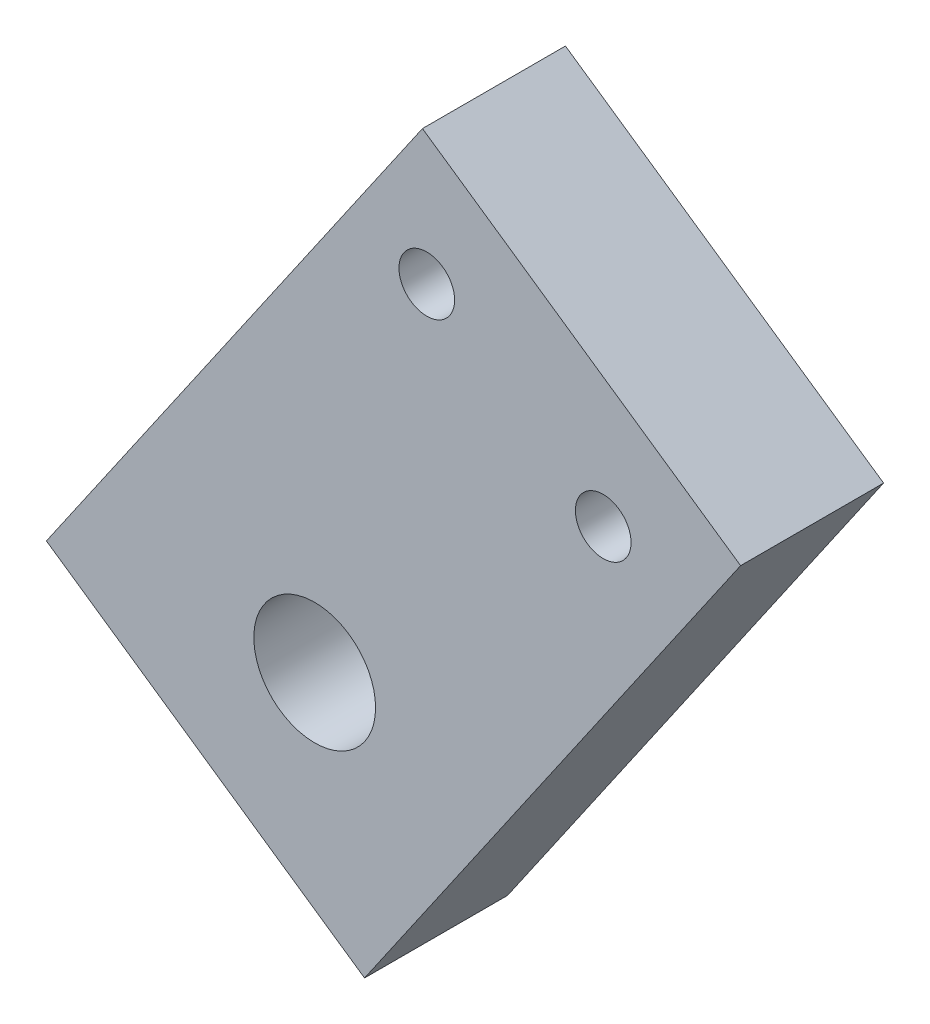
ISO-10303-21;
HEADER;
FILE_DESCRIPTION(('STEP AP214'),'2;1');
FILE_NAME('part.step','',(''),(''),'','','');
FILE_SCHEMA(('AUTOMOTIVE_DESIGN { 1 0 10303 214 1 1 1 1 }'));
ENDSEC;
DATA;
#1=APPLICATION_CONTEXT('core data for automotive mechanical design processes');
#2=APPLICATION_PROTOCOL_DEFINITION('international standard','automotive_design',2000,#1);
#3=PRODUCT_CONTEXT('',#1,'mechanical');
#4=PRODUCT('Part','Part','',(#3));
#5=PRODUCT_RELATED_PRODUCT_CATEGORY('part','',(#4));
#6=PRODUCT_DEFINITION_FORMATION('','',#4);
#7=PRODUCT_DEFINITION_CONTEXT('part definition',#1,'design');
#8=PRODUCT_DEFINITION('design','',#6,#7);
#9=PRODUCT_DEFINITION_SHAPE('','',#8);
#10=(LENGTH_UNIT() NAMED_UNIT(*) SI_UNIT(.MILLI.,.METRE.));
#11=(NAMED_UNIT(*) PLANE_ANGLE_UNIT() SI_UNIT($,.RADIAN.));
#12=(NAMED_UNIT(*) SI_UNIT($,.STERADIAN.) SOLID_ANGLE_UNIT());
#13=UNCERTAINTY_MEASURE_WITH_UNIT(LENGTH_MEASURE(1.E-05),#10,'distance_accuracy_value','');
#14=(GEOMETRIC_REPRESENTATION_CONTEXT(3) GLOBAL_UNCERTAINTY_ASSIGNED_CONTEXT((#13)) GLOBAL_UNIT_ASSIGNED_CONTEXT((#10,
#11,#12)) REPRESENTATION_CONTEXT('',''));
#15=CARTESIAN_POINT('',(0.,0.,0.));
#16=DIRECTION('',(0.,0.,1.));
#17=DIRECTION('',(1.,0.,0.));
#18=AXIS2_PLACEMENT_3D('',#15,#16,#17);
#19=CARTESIAN_POINT('',(-78.6688302859633,-120.640865940608,9.398));
#20=DIRECTION('',(0.,0.,1.));
#21=DIRECTION('',(1.,0.,0.));
#22=AXIS2_PLACEMENT_3D('',#19,#20,#21);
#23=PLANE('',#22);
#24=CARTESIAN_POINT('',(-74.5781091864287,-79.1004132197678,9.398));
#25=DIRECTION('',(0.,0.,1.));
#26=DIRECTION('',(1.,0.,0.));
#27=AXIS2_PLACEMENT_3D('',#24,#25,#26);
#28=CIRCLE('',#27,1.8288);
#29=CARTESIAN_POINT('',(-72.7493091864287,-79.1004132197678,9.398));
#30=VERTEX_POINT('',#29);
#31=EDGE_CURVE('E112',#30,#30,#28,.T.);
#32=ORIENTED_EDGE('',*,*,#31,.F.);
#33=EDGE_LOOP('',(#32));
#34=FACE_BOUND('',#33,.T.);
#35=DIRECTION('',(0.823144688267468,-0.56783168472449,0.));
#36=VECTOR('',#35,1.);
#37=CARTESIAN_POINT('',(-99.576705367957,-106.217941148606,9.398));
#38=LINE('',#37,#36);
#39=CARTESIAN_POINT('',(-99.576705367957,-106.217941148606,9.398));
#40=VERTEX_POINT('',#39);
#41=CARTESIAN_POINT('',(-78.6688302859633,-120.640865940608,9.398));
#42=VERTEX_POINT('',#41);
#43=EDGE_CURVE('E82',#40,#42,#38,.T.);
#44=ORIENTED_EDGE('',*,*,#43,.T.);
#45=DIRECTION('',(0.56783168472449,0.823144688267468,0.));
#46=VECTOR('',#45,1.);
#47=CARTESIAN_POINT('',(-78.6688302859633,-120.640865940608,9.398));
#48=LINE('',#47,#46);
#49=CARTESIAN_POINT('',(-53.954357906258,-84.8140756963151,9.398));
#50=VERTEX_POINT('',#49);
#51=EDGE_CURVE('E77',#42,#50,#48,.T.);
#52=ORIENTED_EDGE('',*,*,#51,.T.);
#53=DIRECTION('',(-0.823144688267468,0.56783168472449,0.));
#54=VECTOR('',#53,1.);
#55=CARTESIAN_POINT('',(-74.8622329882517,-70.3911509043131,9.398));
#56=LINE('',#55,#54);
#57=CARTESIAN_POINT('',(-74.8622329882517,-70.3911509043131,9.398));
#58=VERTEX_POINT('',#57);
#59=EDGE_CURVE('E80',#50,#58,#56,.T.);
#60=ORIENTED_EDGE('',*,*,#59,.T.);
#61=DIRECTION('',(-0.56783168472449,-0.823144688267468,0.));
#62=VECTOR('',#61,1.);
#63=CARTESIAN_POINT('',(-99.576705367957,-106.217941148606,9.398));
#64=LINE('',#63,#62);
#65=EDGE_CURVE('E47',#58,#40,#64,.T.);
#66=ORIENTED_EDGE('',*,*,#65,.T.);
#67=EDGE_LOOP('',(#44,#52,#60,#66));
#68=FACE_BOUND('',#67,.T.);
#69=CARTESIAN_POINT('',(-81.9449970294961,-104.896422338878,9.398));
#70=DIRECTION('',(0.,0.,1.));
#71=DIRECTION('',(1.,0.,0.));
#72=AXIS2_PLACEMENT_3D('',#69,#70,#71);
#73=CIRCLE('',#72,4.00050000000001);
#74=CARTESIAN_POINT('',(-77.9444970294961,-104.896422338878,9.398));
#75=VERTEX_POINT('',#74);
#76=EDGE_CURVE('E97',#75,#75,#73,.T.);
#77=ORIENTED_EDGE('',*,*,#76,.F.);
#78=EDGE_LOOP('',(#77));
#79=FACE_BOUND('',#78,.T.);
#80=CARTESIAN_POINT('',(-62.9827304491089,-87.0992784706499,9.398));
#81=DIRECTION('',(0.,0.,1.));
#82=DIRECTION('',(1.,0.,0.));
#83=AXIS2_PLACEMENT_3D('',#80,#81,#82);
#84=CIRCLE('',#83,1.82879999999998);
#85=CARTESIAN_POINT('',(-61.1539304491089,-87.0992784706499,9.398));
#86=VERTEX_POINT('',#85);
#87=EDGE_CURVE('E118',#86,#86,#84,.T.);
#88=ORIENTED_EDGE('',*,*,#87,.F.);
#89=EDGE_LOOP('',(#88));
#90=FACE_BOUND('',#89,.T.);
#91=ADVANCED_FACE('F30',(#34,#68,#79,#90),#23,.T.);
#92=CARTESIAN_POINT('',(-78.6688302859633,-120.640865940608,0.));
#93=DIRECTION('',(0.,0.,1.));
#94=DIRECTION('',(1.,0.,0.));
#95=AXIS2_PLACEMENT_3D('',#92,#93,#94);
#96=PLANE('',#95);
#97=CARTESIAN_POINT('',(-74.5781091864287,-79.1004132197678,0.));
#98=DIRECTION('',(0.,0.,1.));
#99=DIRECTION('',(1.,0.,0.));
#100=AXIS2_PLACEMENT_3D('',#97,#98,#99);
#101=CIRCLE('',#100,1.8288);
#102=CARTESIAN_POINT('',(-72.7493091864287,-79.1004132197678,0.));
#103=VERTEX_POINT('',#102);
#104=EDGE_CURVE('E115',#103,#103,#101,.T.);
#105=ORIENTED_EDGE('',*,*,#104,.T.);
#106=EDGE_LOOP('',(#105));
#107=FACE_BOUND('',#106,.T.);
#108=DIRECTION('',(0.823144688267468,-0.56783168472449,0.));
#109=VECTOR('',#108,1.);
#110=CARTESIAN_POINT('',(-99.576705367957,-106.217941148606,0.));
#111=LINE('',#110,#109);
#112=CARTESIAN_POINT('',(-99.576705367957,-106.217941148606,0.));
#113=VERTEX_POINT('',#112);
#114=CARTESIAN_POINT('',(-78.6688302859633,-120.640865940608,0.));
#115=VERTEX_POINT('',#114);
#116=EDGE_CURVE('E94',#113,#115,#111,.T.);
#117=ORIENTED_EDGE('',*,*,#116,.F.);
#118=DIRECTION('',(-0.56783168472449,-0.823144688267468,0.));
#119=VECTOR('',#118,1.);
#120=CARTESIAN_POINT('',(-99.576705367957,-106.217941148606,0.));
#121=LINE('',#120,#119);
#122=CARTESIAN_POINT('',(-74.8622329882517,-70.3911509043131,0.));
#123=VERTEX_POINT('',#122);
#124=EDGE_CURVE('E70',#123,#113,#121,.T.);
#125=ORIENTED_EDGE('',*,*,#124,.F.);
#126=DIRECTION('',(-0.823144688267468,0.56783168472449,0.));
#127=VECTOR('',#126,1.);
#128=CARTESIAN_POINT('',(-74.8622329882517,-70.3911509043131,0.));
#129=LINE('',#128,#127);
#130=CARTESIAN_POINT('',(-53.954357906258,-84.8140756963151,0.));
#131=VERTEX_POINT('',#130);
#132=EDGE_CURVE('E64',#131,#123,#129,.T.);
#133=ORIENTED_EDGE('',*,*,#132,.F.);
#134=DIRECTION('',(0.56783168472449,0.823144688267468,0.));
#135=VECTOR('',#134,1.);
#136=CARTESIAN_POINT('',(-78.6688302859633,-120.640865940608,0.));
#137=LINE('',#136,#135);
#138=EDGE_CURVE('E86',#115,#131,#137,.T.);
#139=ORIENTED_EDGE('',*,*,#138,.F.);
#140=EDGE_LOOP('',(#117,#125,#133,#139));
#141=FACE_BOUND('',#140,.T.);
#142=CARTESIAN_POINT('',(-81.9449970294961,-104.896422338878,0.));
#143=DIRECTION('',(0.,0.,1.));
#144=DIRECTION('',(1.,0.,0.));
#145=AXIS2_PLACEMENT_3D('',#142,#143,#144);
#146=CIRCLE('',#145,4.00050000000001);
#147=CARTESIAN_POINT('',(-77.9444970294961,-104.896422338878,0.));
#148=VERTEX_POINT('',#147);
#149=EDGE_CURVE('E109',#148,#148,#146,.T.);
#150=ORIENTED_EDGE('',*,*,#149,.T.);
#151=EDGE_LOOP('',(#150));
#152=FACE_BOUND('',#151,.T.);
#153=CARTESIAN_POINT('',(-62.9827304491089,-87.0992784706499,0.));
#154=DIRECTION('',(0.,0.,1.));
#155=DIRECTION('',(1.,0.,0.));
#156=AXIS2_PLACEMENT_3D('',#153,#154,#155);
#157=CIRCLE('',#156,1.82879999999998);
#158=CARTESIAN_POINT('',(-61.1539304491089,-87.0992784706499,0.));
#159=VERTEX_POINT('',#158);
#160=EDGE_CURVE('E121',#159,#159,#157,.T.);
#161=ORIENTED_EDGE('',*,*,#160,.T.);
#162=EDGE_LOOP('',(#161));
#163=FACE_BOUND('',#162,.T.);
#164=ADVANCED_FACE('F105',(#107,#141,#152,#163),#96,.F.);
#165=CARTESIAN_POINT('',(-99.576705367957,-106.217941148606,9.398));
#166=DIRECTION('',(0.56783168472449,0.823144688267468,0.));
#167=DIRECTION('',(-0.823144688267468,0.56783168472449,0.));
#168=AXIS2_PLACEMENT_3D('',#165,#166,#167);
#169=PLANE('',#168);
#170=ORIENTED_EDGE('',*,*,#116,.T.);
#171=DIRECTION('',(0.,0.,-1.));
#172=VECTOR('',#171,1.);
#173=CARTESIAN_POINT('',(-78.6688302859633,-120.640865940608,9.398));
#174=LINE('',#173,#172);
#175=EDGE_CURVE('E11',#42,#115,#174,.T.);
#176=ORIENTED_EDGE('',*,*,#175,.F.);
#177=ORIENTED_EDGE('',*,*,#43,.F.);
#178=DIRECTION('',(0.,0.,-1.));
#179=VECTOR('',#178,1.);
#180=CARTESIAN_POINT('',(-99.576705367957,-106.217941148606,9.398));
#181=LINE('',#180,#179);
#182=EDGE_CURVE('E90',#40,#113,#181,.T.);
#183=ORIENTED_EDGE('',*,*,#182,.T.);
#184=EDGE_LOOP('',(#170,#176,#177,#183));
#185=FACE_BOUND('',#184,.T.);
#186=ADVANCED_FACE('F32',(#185),#169,.F.);
#187=CARTESIAN_POINT('',(-78.6688302859633,-120.640865940608,9.398));
#188=DIRECTION('',(-0.823144688267468,0.56783168472449,0.));
#189=DIRECTION('',(-0.56783168472449,-0.823144688267468,0.));
#190=AXIS2_PLACEMENT_3D('',#187,#188,#189);
#191=PLANE('',#190);
#192=ORIENTED_EDGE('',*,*,#138,.T.);
#193=DIRECTION('',(0.,0.,-1.));
#194=VECTOR('',#193,1.);
#195=CARTESIAN_POINT('',(-53.954357906258,-84.8140756963151,9.398));
#196=LINE('',#195,#194);
#197=EDGE_CURVE('E39',#50,#131,#196,.T.);
#198=ORIENTED_EDGE('',*,*,#197,.F.);
#199=ORIENTED_EDGE('',*,*,#51,.F.);
#200=ORIENTED_EDGE('',*,*,#175,.T.);
#201=EDGE_LOOP('',(#192,#198,#199,#200));
#202=FACE_BOUND('',#201,.T.);
#203=ADVANCED_FACE('F85',(#202),#191,.F.);
#204=CARTESIAN_POINT('',(-74.8622329882517,-70.3911509043131,9.398));
#205=DIRECTION('',(-0.56783168472449,-0.823144688267468,0.));
#206=DIRECTION('',(0.823144688267468,-0.56783168472449,0.));
#207=AXIS2_PLACEMENT_3D('',#204,#205,#206);
#208=PLANE('',#207);
#209=ORIENTED_EDGE('',*,*,#132,.T.);
#210=DIRECTION('',(0.,0.,-1.));
#211=VECTOR('',#210,1.);
#212=CARTESIAN_POINT('',(-74.8622329882517,-70.3911509043131,9.398));
#213=LINE('',#212,#211);
#214=EDGE_CURVE('E87',#58,#123,#213,.T.);
#215=ORIENTED_EDGE('',*,*,#214,.F.);
#216=ORIENTED_EDGE('',*,*,#59,.F.);
#217=ORIENTED_EDGE('',*,*,#197,.T.);
#218=EDGE_LOOP('',(#209,#215,#216,#217));
#219=FACE_BOUND('',#218,.T.);
#220=ADVANCED_FACE('F88',(#219),#208,.F.);
#221=CARTESIAN_POINT('',(-99.576705367957,-106.217941148606,9.398));
#222=DIRECTION('',(0.823144688267468,-0.56783168472449,0.));
#223=DIRECTION('',(0.56783168472449,0.823144688267468,0.));
#224=AXIS2_PLACEMENT_3D('',#221,#222,#223);
#225=PLANE('',#224);
#226=ORIENTED_EDGE('',*,*,#124,.T.);
#227=ORIENTED_EDGE('',*,*,#182,.F.);
#228=ORIENTED_EDGE('',*,*,#65,.F.);
#229=ORIENTED_EDGE('',*,*,#214,.T.);
#230=EDGE_LOOP('',(#226,#227,#228,#229));
#231=FACE_BOUND('',#230,.T.);
#232=ADVANCED_FACE('F102',(#231),#225,.F.);
#233=CARTESIAN_POINT('',(-81.9449970294961,-104.896422338878,9.398));
#234=DIRECTION('',(0.,0.,-1.));
#235=DIRECTION('',(-1.,0.,0.));
#236=AXIS2_PLACEMENT_3D('',#233,#234,#235);
#237=CYLINDRICAL_SURFACE('',#236,4.00050000000001);
#238=ORIENTED_EDGE('',*,*,#76,.T.);
#239=EDGE_LOOP('',(#238));
#240=FACE_BOUND('',#239,.T.);
#241=ORIENTED_EDGE('',*,*,#149,.F.);
#242=EDGE_LOOP('',(#241));
#243=FACE_BOUND('',#242,.T.);
#244=ADVANCED_FACE('F140',(#240,#243),#237,.F.);
#245=CARTESIAN_POINT('',(-74.5781091864287,-79.1004132197678,9.398));
#246=DIRECTION('',(0.,0.,-1.));
#247=DIRECTION('',(-1.,0.,0.));
#248=AXIS2_PLACEMENT_3D('',#245,#246,#247);
#249=CYLINDRICAL_SURFACE('',#248,1.8288);
#250=ORIENTED_EDGE('',*,*,#31,.T.);
#251=EDGE_LOOP('',(#250));
#252=FACE_BOUND('',#251,.T.);
#253=ORIENTED_EDGE('',*,*,#104,.F.);
#254=EDGE_LOOP('',(#253));
#255=FACE_BOUND('',#254,.T.);
#256=ADVANCED_FACE('F186',(#252,#255),#249,.F.);
#257=CARTESIAN_POINT('',(-62.9827304491089,-87.0992784706499,9.398));
#258=DIRECTION('',(0.,0.,-1.));
#259=DIRECTION('',(-1.,0.,0.));
#260=AXIS2_PLACEMENT_3D('',#257,#258,#259);
#261=CYLINDRICAL_SURFACE('',#260,1.82879999999998);
#262=ORIENTED_EDGE('',*,*,#87,.T.);
#263=EDGE_LOOP('',(#262));
#264=FACE_BOUND('',#263,.T.);
#265=ORIENTED_EDGE('',*,*,#160,.F.);
#266=EDGE_LOOP('',(#265));
#267=FACE_BOUND('',#266,.T.);
#268=ADVANCED_FACE('F127',(#264,#267),#261,.F.);
#269=CLOSED_SHELL('',(#91,#164,#186,#203,#220,#232,#244,#256,#268));
#270=MANIFOLD_SOLID_BREP('B2',#269);
#271=ADVANCED_BREP_SHAPE_REPRESENTATION('',(#18,#270),#14);
#272=SHAPE_DEFINITION_REPRESENTATION(#9,#271);
ENDSEC;
END-ISO-10303-21;
